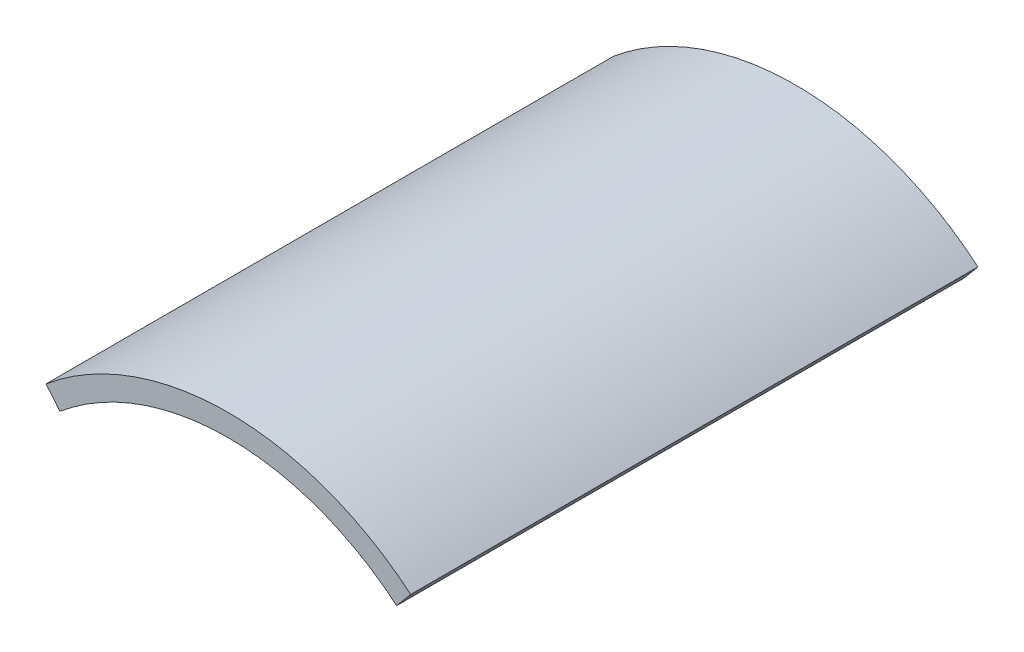
ISO-10303-21;
HEADER;
FILE_DESCRIPTION(('STEP AP214'),'2;1');
FILE_NAME('part.step','',(''),(''),'','','');
FILE_SCHEMA(('AUTOMOTIVE_DESIGN { 1 0 10303 214 1 1 1 1 }'));
ENDSEC;
DATA;
#1=APPLICATION_CONTEXT('core data for automotive mechanical design processes');
#2=APPLICATION_PROTOCOL_DEFINITION('international standard','automotive_design',2000,#1);
#3=PRODUCT_CONTEXT('',#1,'mechanical');
#4=PRODUCT('Part','Part','',(#3));
#5=PRODUCT_RELATED_PRODUCT_CATEGORY('part','',(#4));
#6=PRODUCT_DEFINITION_FORMATION('','',#4);
#7=PRODUCT_DEFINITION_CONTEXT('part definition',#1,'design');
#8=PRODUCT_DEFINITION('design','',#6,#7);
#9=PRODUCT_DEFINITION_SHAPE('','',#8);
#10=(LENGTH_UNIT() NAMED_UNIT(*) SI_UNIT(.MILLI.,.METRE.));
#11=(NAMED_UNIT(*) PLANE_ANGLE_UNIT() SI_UNIT($,.RADIAN.));
#12=(NAMED_UNIT(*) SI_UNIT($,.STERADIAN.) SOLID_ANGLE_UNIT());
#13=UNCERTAINTY_MEASURE_WITH_UNIT(LENGTH_MEASURE(1.E-05),#10,'distance_accuracy_value','');
#14=(GEOMETRIC_REPRESENTATION_CONTEXT(3) GLOBAL_UNCERTAINTY_ASSIGNED_CONTEXT((#13)) GLOBAL_UNIT_ASSIGNED_CONTEXT((#10,
#11,#12)) REPRESENTATION_CONTEXT('',''));
#15=CARTESIAN_POINT('',(0.,0.,0.));
#16=DIRECTION('',(0.,0.,1.));
#17=DIRECTION('',(1.,0.,0.));
#18=AXIS2_PLACEMENT_3D('',#15,#16,#17);
#19=CARTESIAN_POINT('',(0.,0.,140.));
#20=DIRECTION('',(0.,0.,-1.));
#21=DIRECTION('',(-1.,0.,0.));
#22=AXIS2_PLACEMENT_3D('',#19,#20,#21);
#23=CYLINDRICAL_SURFACE('',#22,60.);
#24=CARTESIAN_POINT('',(0.,0.,10.));
#25=DIRECTION('',(0.,0.,-1.));
#26=DIRECTION('',(1.,0.,0.));
#27=AXIS2_PLACEMENT_3D('',#24,#25,#26);
#28=CIRCLE('',#27,60.);
#29=CARTESIAN_POINT('',(-38.5672565811925,45.9626665871386,10.));
#30=VERTEX_POINT('',#29);
#31=CARTESIAN_POINT('',(38.5672565811925,45.9626665871386,10.));
#32=VERTEX_POINT('',#31);
#33=EDGE_CURVE('E95',#30,#32,#28,.T.);
#34=ORIENTED_EDGE('',*,*,#33,.T.);
#35=DIRECTION('',(0.,0.,-1.));
#36=VECTOR('',#35,1.);
#37=CARTESIAN_POINT('',(38.5672565811925,45.9626665871386,140.));
#38=LINE('',#37,#36);
#39=CARTESIAN_POINT('',(38.5672565811925,45.9626665871386,140.));
#40=VERTEX_POINT('',#39);
#41=EDGE_CURVE('E11',#40,#32,#38,.T.);
#42=ORIENTED_EDGE('',*,*,#41,.F.);
#43=CARTESIAN_POINT('',(0.,0.,140.));
#44=DIRECTION('',(0.,0.,-1.));
#45=DIRECTION('',(1.,0.,0.));
#46=AXIS2_PLACEMENT_3D('',#43,#44,#45);
#47=CIRCLE('',#46,60.);
#48=CARTESIAN_POINT('',(-38.5672565811925,45.9626665871386,140.));
#49=VERTEX_POINT('',#48);
#50=EDGE_CURVE('E83',#49,#40,#47,.T.);
#51=ORIENTED_EDGE('',*,*,#50,.F.);
#52=DIRECTION('',(0.,0.,-1.));
#53=VECTOR('',#52,1.);
#54=CARTESIAN_POINT('',(-38.5672565811925,45.9626665871386,140.));
#55=LINE('',#54,#53);
#56=EDGE_CURVE('E91',#49,#30,#55,.T.);
#57=ORIENTED_EDGE('',*,*,#56,.T.);
#58=EDGE_LOOP('',(#34,#42,#51,#57));
#59=FACE_BOUND('',#58,.T.);
#60=ADVANCED_FACE('F32',(#59),#23,.F.);
#61=CARTESIAN_POINT('',(41.7811946296252,49.7928888027335,140.));
#62=DIRECTION('',(-0.766044443118977,0.64278760968654,0.));
#63=DIRECTION('',(-0.642787609686541,-0.766044443118977,0.));
#64=AXIS2_PLACEMENT_3D('',#61,#62,#63);
#65=PLANE('',#64);
#66=DIRECTION('',(0.642787609686541,0.766044443118977,0.));
#67=VECTOR('',#66,1.);
#68=CARTESIAN_POINT('',(41.7811946296252,49.7928888027335,10.));
#69=LINE('',#68,#67);
#70=CARTESIAN_POINT('',(41.7811946296252,49.7928888027335,10.));
#71=VERTEX_POINT('',#70);
#72=EDGE_CURVE('E87',#32,#71,#69,.T.);
#73=ORIENTED_EDGE('',*,*,#72,.T.);
#74=DIRECTION('',(0.,0.,-1.));
#75=VECTOR('',#74,1.);
#76=CARTESIAN_POINT('',(41.7811946296252,49.7928888027335,140.));
#77=LINE('',#76,#75);
#78=CARTESIAN_POINT('',(41.7811946296252,49.7928888027335,140.));
#79=VERTEX_POINT('',#78);
#80=EDGE_CURVE('E40',#79,#71,#77,.T.);
#81=ORIENTED_EDGE('',*,*,#80,.F.);
#82=DIRECTION('',(0.642787609686541,0.766044443118977,0.));
#83=VECTOR('',#82,1.);
#84=CARTESIAN_POINT('',(41.7811946296252,49.7928888027335,140.));
#85=LINE('',#84,#83);
#86=EDGE_CURVE('E78',#40,#79,#85,.T.);
#87=ORIENTED_EDGE('',*,*,#86,.F.);
#88=ORIENTED_EDGE('',*,*,#41,.T.);
#89=EDGE_LOOP('',(#73,#81,#87,#88));
#90=FACE_BOUND('',#89,.T.);
#91=ADVANCED_FACE('F86',(#90),#65,.F.);
#92=CARTESIAN_POINT('',(0.,0.,140.));
#93=DIRECTION('',(0.,0.,-1.));
#94=DIRECTION('',(-1.,0.,0.));
#95=AXIS2_PLACEMENT_3D('',#92,#93,#94);
#96=CYLINDRICAL_SURFACE('',#95,65.);
#97=CARTESIAN_POINT('',(0.,0.,10.));
#98=DIRECTION('',(0.,0.,1.));
#99=DIRECTION('',(1.,0.,0.));
#100=AXIS2_PLACEMENT_3D('',#97,#98,#99);
#101=CIRCLE('',#100,65.);
#102=CARTESIAN_POINT('',(-41.7811946296252,49.7928888027335,10.));
#103=VERTEX_POINT('',#102);
#104=EDGE_CURVE('E65',#71,#103,#101,.T.);
#105=ORIENTED_EDGE('',*,*,#104,.T.);
#106=DIRECTION('',(0.,0.,-1.));
#107=VECTOR('',#106,1.);
#108=CARTESIAN_POINT('',(-41.7811946296252,49.7928888027335,140.));
#109=LINE('',#108,#107);
#110=CARTESIAN_POINT('',(-41.7811946296252,49.7928888027335,140.));
#111=VERTEX_POINT('',#110);
#112=EDGE_CURVE('E88',#111,#103,#109,.T.);
#113=ORIENTED_EDGE('',*,*,#112,.F.);
#114=CARTESIAN_POINT('',(0.,0.,140.));
#115=DIRECTION('',(0.,0.,1.));
#116=DIRECTION('',(1.,0.,0.));
#117=AXIS2_PLACEMENT_3D('',#114,#115,#116);
#118=CIRCLE('',#117,65.);
#119=EDGE_CURVE('E81',#79,#111,#118,.T.);
#120=ORIENTED_EDGE('',*,*,#119,.F.);
#121=ORIENTED_EDGE('',*,*,#80,.T.);
#122=EDGE_LOOP('',(#105,#113,#120,#121));
#123=FACE_BOUND('',#122,.T.);
#124=ADVANCED_FACE('F89',(#123),#96,.T.);
#125=CARTESIAN_POINT('',(-41.7811946296252,49.7928888027335,140.));
#126=DIRECTION('',(0.766044443118976,0.642787609686541,0.));
#127=DIRECTION('',(-0.642787609686541,0.766044443118977,0.));
#128=AXIS2_PLACEMENT_3D('',#125,#126,#127);
#129=PLANE('',#128);
#130=DIRECTION('',(0.642787609686541,-0.766044443118976,0.));
#131=VECTOR('',#130,1.);
#132=CARTESIAN_POINT('',(-41.7811946296252,49.7928888027335,10.));
#133=LINE('',#132,#131);
#134=EDGE_CURVE('E71',#103,#30,#133,.T.);
#135=ORIENTED_EDGE('',*,*,#134,.T.);
#136=ORIENTED_EDGE('',*,*,#56,.F.);
#137=DIRECTION('',(0.642787609686541,-0.766044443118976,0.));
#138=VECTOR('',#137,1.);
#139=CARTESIAN_POINT('',(-41.7811946296252,49.7928888027335,140.));
#140=LINE('',#139,#138);
#141=EDGE_CURVE('E48',#111,#49,#140,.T.);
#142=ORIENTED_EDGE('',*,*,#141,.F.);
#143=ORIENTED_EDGE('',*,*,#112,.T.);
#144=EDGE_LOOP('',(#135,#136,#142,#143));
#145=FACE_BOUND('',#144,.T.);
#146=ADVANCED_FACE('F102',(#145),#129,.F.);
#147=CARTESIAN_POINT('',(0.,0.,140.));
#148=DIRECTION('',(0.,0.,1.));
#149=DIRECTION('',(1.,0.,0.));
#150=AXIS2_PLACEMENT_3D('',#147,#148,#149);
#151=PLANE('',#150);
#152=ORIENTED_EDGE('',*,*,#50,.T.);
#153=ORIENTED_EDGE('',*,*,#86,.T.);
#154=ORIENTED_EDGE('',*,*,#119,.T.);
#155=ORIENTED_EDGE('',*,*,#141,.T.);
#156=EDGE_LOOP('',(#152,#153,#154,#155));
#157=FACE_BOUND('',#156,.T.);
#158=ADVANCED_FACE('F79',(#157),#151,.T.);
#159=CARTESIAN_POINT('',(0.,0.,10.));
#160=DIRECTION('',(0.,0.,1.));
#161=DIRECTION('',(1.,0.,0.));
#162=AXIS2_PLACEMENT_3D('',#159,#160,#161);
#163=PLANE('',#162);
#164=ORIENTED_EDGE('',*,*,#33,.F.);
#165=ORIENTED_EDGE('',*,*,#134,.F.);
#166=ORIENTED_EDGE('',*,*,#104,.F.);
#167=ORIENTED_EDGE('',*,*,#72,.F.);
#168=EDGE_LOOP('',(#164,#165,#166,#167));
#169=FACE_BOUND('',#168,.T.);
#170=ADVANCED_FACE('F105',(#169),#163,.F.);
#171=CLOSED_SHELL('',(#60,#91,#124,#146,#158,#170));
#172=MANIFOLD_SOLID_BREP('B2',#171);
#173=ADVANCED_BREP_SHAPE_REPRESENTATION('',(#18,#172),#14);
#174=SHAPE_DEFINITION_REPRESENTATION(#9,#173);
ENDSEC;
END-ISO-10303-21;
